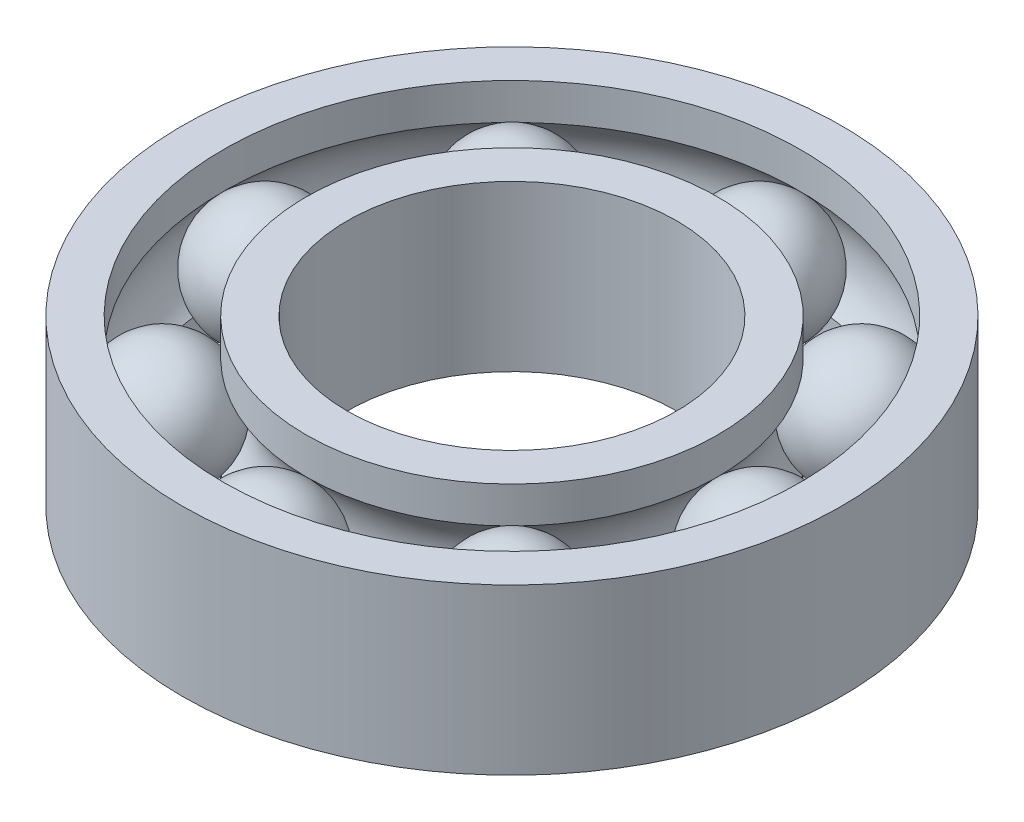
ISO-10303-21;
HEADER;
FILE_DESCRIPTION(('STEP AP214'),'2;1');
FILE_NAME('part.step','',(''),(''),'','','');
FILE_SCHEMA(('AUTOMOTIVE_DESIGN { 1 0 10303 214 1 1 1 1 }'));
ENDSEC;
DATA;
#1=APPLICATION_CONTEXT('core data for automotive mechanical design processes');
#2=APPLICATION_PROTOCOL_DEFINITION('international standard','automotive_design',2000,#1);
#3=PRODUCT_CONTEXT('',#1,'mechanical');
#4=PRODUCT('Part','Part','',(#3));
#5=PRODUCT_RELATED_PRODUCT_CATEGORY('part','',(#4));
#6=PRODUCT_DEFINITION_FORMATION('','',#4);
#7=PRODUCT_DEFINITION_CONTEXT('part definition',#1,'design');
#8=PRODUCT_DEFINITION('design','',#6,#7);
#9=PRODUCT_DEFINITION_SHAPE('','',#8);
#10=(LENGTH_UNIT() NAMED_UNIT(*) SI_UNIT(.MILLI.,.METRE.));
#11=(NAMED_UNIT(*) PLANE_ANGLE_UNIT() SI_UNIT($,.RADIAN.));
#12=(NAMED_UNIT(*) SI_UNIT($,.STERADIAN.) SOLID_ANGLE_UNIT());
#13=UNCERTAINTY_MEASURE_WITH_UNIT(LENGTH_MEASURE(1.E-05),#10,'distance_accuracy_value','');
#14=(GEOMETRIC_REPRESENTATION_CONTEXT(3) GLOBAL_UNCERTAINTY_ASSIGNED_CONTEXT((#13)) GLOBAL_UNIT_ASSIGNED_CONTEXT((#10,
#11,#12)) REPRESENTATION_CONTEXT('',''));
#15=CARTESIAN_POINT('',(0.,0.,0.));
#16=DIRECTION('',(0.,0.,1.));
#17=DIRECTION('',(1.,0.,0.));
#18=AXIS2_PLACEMENT_3D('',#15,#16,#17);
#19=CARTESIAN_POINT('',(-8.4808867879679,0.,8.48088678796769));
#20=DIRECTION('',(0.,1.,0.));
#21=DIRECTION('',(0.707106781186556,0.,-0.707106781186539));
#22=AXIS2_PLACEMENT_3D('',#19,#20,#21);
#23=SPHERICAL_SURFACE('',#22,3.);
#24=CARTESIAN_POINT('',(-8.4808867879679,3.,8.48088678796769));
#25=VERTEX_POINT('',#24);
#26=VERTEX_LOOP('',#25);
#27=FACE_BOUND('',#26,.T.);
#28=ADVANCED_FACE('F47',(#27),#23,.T.);
#29=CLOSED_SHELL('',(#28));
#30=MANIFOLD_SOLID_BREP('B2',#29);
#31=CARTESIAN_POINT('',(-1.25628230749009E-13,0.,11.9937851164948));
#32=DIRECTION('',(0.,1.,0.));
#33=DIRECTION('',(0.,0.,-1.));
#34=AXIS2_PLACEMENT_3D('',#31,#32,#33);
#35=SPHERICAL_SURFACE('',#34,3.);
#36=CARTESIAN_POINT('',(-1.25628230749009E-13,3.,11.9937851164948));
#37=VERTEX_POINT('',#36);
#38=VERTEX_LOOP('',#37);
#39=FACE_BOUND('',#38,.T.);
#40=ADVANCED_FACE('F72',(#39),#35,.T.);
#41=CLOSED_SHELL('',(#40));
#42=MANIFOLD_SOLID_BREP('B6',#41);
#43=CARTESIAN_POINT('',(8.48088678796772,0.,8.48088678796787));
#44=DIRECTION('',(0.,1.,0.));
#45=DIRECTION('',(-0.707106781186541,0.,-0.707106781186554));
#46=AXIS2_PLACEMENT_3D('',#43,#44,#45);
#47=SPHERICAL_SURFACE('',#46,3.);
#48=CARTESIAN_POINT('',(8.48088678796772,3.,8.48088678796787));
#49=VERTEX_POINT('',#48);
#50=VERTEX_LOOP('',#49);
#51=FACE_BOUND('',#50,.T.);
#52=ADVANCED_FACE('F94',(#51),#47,.T.);
#53=CLOSED_SHELL('',(#52));
#54=MANIFOLD_SOLID_BREP('B43',#53);
#55=CARTESIAN_POINT('',(11.9937851164948,0.,0.));
#56=DIRECTION('',(0.,1.,0.));
#57=DIRECTION('',(-1.,0.,0.));
#58=AXIS2_PLACEMENT_3D('',#55,#56,#57);
#59=SPHERICAL_SURFACE('',#58,3.);
#60=CARTESIAN_POINT('',(11.9937851164948,3.,0.));
#61=VERTEX_POINT('',#60);
#62=VERTEX_LOOP('',#61);
#63=FACE_BOUND('',#62,.T.);
#64=ADVANCED_FACE('F118',(#63),#59,.T.);
#65=CLOSED_SHELL('',(#64));
#66=MANIFOLD_SOLID_BREP('B68',#65);
#67=CARTESIAN_POINT('',(8.48088678796784,0.,-8.48088678796775));
#68=DIRECTION('',(0.,1.,0.));
#69=DIRECTION('',(-0.707106781186551,0.,0.707106781186544));
#70=AXIS2_PLACEMENT_3D('',#67,#68,#69);
#71=SPHERICAL_SURFACE('',#70,3.);
#72=CARTESIAN_POINT('',(8.48088678796784,3.,-8.48088678796775));
#73=VERTEX_POINT('',#72);
#74=VERTEX_LOOP('',#73);
#75=FACE_BOUND('',#74,.T.);
#76=ADVANCED_FACE('F140',(#75),#71,.T.);
#77=CLOSED_SHELL('',(#76));
#78=MANIFOLD_SOLID_BREP('B90',#77);
#79=CARTESIAN_POINT('',(0.,0.,-11.9937851164948));
#80=DIRECTION('',(0.,1.,0.));
#81=DIRECTION('',(0.,0.,1.));
#82=AXIS2_PLACEMENT_3D('',#79,#80,#81);
#83=SPHERICAL_SURFACE('',#82,3.);
#84=CARTESIAN_POINT('',(0.,3.,-11.9937851164948));
#85=VERTEX_POINT('',#84);
#86=VERTEX_LOOP('',#85);
#87=FACE_BOUND('',#86,.T.);
#88=ADVANCED_FACE('F162',(#87),#83,.T.);
#89=CLOSED_SHELL('',(#88));
#90=MANIFOLD_SOLID_BREP('B114',#89);
#91=CARTESIAN_POINT('',(-8.48088678796778,0.,-8.48088678796781));
#92=DIRECTION('',(0.,1.,0.));
#93=DIRECTION('',(0.707106781186546,0.,0.707106781186549));
#94=AXIS2_PLACEMENT_3D('',#91,#92,#93);
#95=SPHERICAL_SURFACE('',#94,3.);
#96=CARTESIAN_POINT('',(-8.48088678796778,3.,-8.48088678796781));
#97=VERTEX_POINT('',#96);
#98=VERTEX_LOOP('',#97);
#99=FACE_BOUND('',#98,.T.);
#100=ADVANCED_FACE('F186',(#99),#95,.T.);
#101=CLOSED_SHELL('',(#100));
#102=MANIFOLD_SOLID_BREP('B136',#101);
#103=CARTESIAN_POINT('',(0.,0.,0.));
#104=DIRECTION('',(0.,1.,0.));
#105=DIRECTION('',(0.,0.,1.));
#106=AXIS2_PLACEMENT_3D('',#103,#104,#105);
#107=TOROIDAL_SURFACE('',#106,12.,3.);
#108=CARTESIAN_POINT('',(0.,-2.23606797749979,0.));
#109=DIRECTION('',(0.,1.,0.));
#110=DIRECTION('',(0.,0.,1.));
#111=AXIS2_PLACEMENT_3D('',#108,#109,#110);
#112=CIRCLE('',#111,10.);
#113=CARTESIAN_POINT('',(0.,-2.23606797749979,10.));
#114=VERTEX_POINT('',#113);
#115=EDGE_CURVE('E185',#114,#114,#112,.T.);
#116=ORIENTED_EDGE('',*,*,#115,.T.);
#117=EDGE_LOOP('',(#116));
#118=FACE_BOUND('',#117,.T.);
#119=CARTESIAN_POINT('',(0.,2.23606797749979,0.));
#120=DIRECTION('',(0.,1.,0.));
#121=DIRECTION('',(0.,0.,1.));
#122=AXIS2_PLACEMENT_3D('',#119,#120,#121);
#123=CIRCLE('',#122,10.);
#124=CARTESIAN_POINT('',(0.,2.23606797749979,10.));
#125=VERTEX_POINT('',#124);
#126=EDGE_CURVE('E232',#125,#125,#123,.T.);
#127=ORIENTED_EDGE('',*,*,#126,.F.);
#128=EDGE_LOOP('',(#127));
#129=FACE_BOUND('',#128,.T.);
#130=ADVANCED_FACE('F210',(#118,#129),#107,.F.);
#131=CARTESIAN_POINT('',(0.,8.8,0.));
#132=DIRECTION('',(0.,1.,0.));
#133=DIRECTION('',(0.,0.,1.));
#134=AXIS2_PLACEMENT_3D('',#131,#132,#133);
#135=CYLINDRICAL_SURFACE('',#134,10.);
#136=CARTESIAN_POINT('',(0.,-4.,0.));
#137=DIRECTION('',(0.,1.,0.));
#138=DIRECTION('',(0.,0.,1.));
#139=AXIS2_PLACEMENT_3D('',#136,#137,#138);
#140=CIRCLE('',#139,10.);
#141=CARTESIAN_POINT('',(0.,-4.,10.));
#142=VERTEX_POINT('',#141);
#143=EDGE_CURVE('E216',#142,#142,#140,.T.);
#144=ORIENTED_EDGE('',*,*,#143,.T.);
#145=EDGE_LOOP('',(#144));
#146=FACE_BOUND('',#145,.T.);
#147=ORIENTED_EDGE('',*,*,#115,.F.);
#148=EDGE_LOOP('',(#147));
#149=FACE_BOUND('',#148,.T.);
#150=ADVANCED_FACE('F240',(#146,#149),#135,.T.);
#151=CARTESIAN_POINT('',(-8.,-4.,0.));
#152=DIRECTION('',(0.,-1.,0.));
#153=DIRECTION('',(0.,0.,-1.));
#154=AXIS2_PLACEMENT_3D('',#151,#152,#153);
#155=PLANE('',#154);
#156=CARTESIAN_POINT('',(0.,-4.,0.));
#157=DIRECTION('',(0.,1.,0.));
#158=DIRECTION('',(0.,0.,1.));
#159=AXIS2_PLACEMENT_3D('',#156,#157,#158);
#160=CIRCLE('',#159,8.);
#161=CARTESIAN_POINT('',(0.,-4.,8.));
#162=VERTEX_POINT('',#161);
#163=EDGE_CURVE('E220',#162,#162,#160,.T.);
#164=ORIENTED_EDGE('',*,*,#163,.T.);
#165=EDGE_LOOP('',(#164));
#166=FACE_BOUND('',#165,.T.);
#167=ORIENTED_EDGE('',*,*,#143,.F.);
#168=EDGE_LOOP('',(#167));
#169=FACE_BOUND('',#168,.T.);
#170=ADVANCED_FACE('F244',(#166,#169),#155,.T.);
#171=CARTESIAN_POINT('',(0.,8.8,0.));
#172=DIRECTION('',(0.,1.,0.));
#173=DIRECTION('',(0.,0.,1.));
#174=AXIS2_PLACEMENT_3D('',#171,#172,#173);
#175=CYLINDRICAL_SURFACE('',#174,8.);
#176=CARTESIAN_POINT('',(0.,4.00000000000001,0.));
#177=DIRECTION('',(0.,1.,0.));
#178=DIRECTION('',(0.,0.,1.));
#179=AXIS2_PLACEMENT_3D('',#176,#177,#178);
#180=CIRCLE('',#179,8.);
#181=CARTESIAN_POINT('',(0.,4.00000000000001,8.));
#182=VERTEX_POINT('',#181);
#183=EDGE_CURVE('E224',#182,#182,#180,.T.);
#184=ORIENTED_EDGE('',*,*,#183,.T.);
#185=EDGE_LOOP('',(#184));
#186=FACE_BOUND('',#185,.T.);
#187=ORIENTED_EDGE('',*,*,#163,.F.);
#188=EDGE_LOOP('',(#187));
#189=FACE_BOUND('',#188,.T.);
#190=ADVANCED_FACE('F248',(#186,#189),#175,.F.);
#191=CARTESIAN_POINT('',(-8.,4.00000000000001,0.));
#192=DIRECTION('',(0.,1.,0.));
#193=DIRECTION('',(0.,0.,1.));
#194=AXIS2_PLACEMENT_3D('',#191,#192,#193);
#195=PLANE('',#194);
#196=CARTESIAN_POINT('',(0.,4.00000000000001,0.));
#197=DIRECTION('',(0.,1.,0.));
#198=DIRECTION('',(0.,0.,1.));
#199=AXIS2_PLACEMENT_3D('',#196,#197,#198);
#200=CIRCLE('',#199,10.);
#201=CARTESIAN_POINT('',(0.,4.00000000000001,10.));
#202=VERTEX_POINT('',#201);
#203=EDGE_CURVE('E229',#202,#202,#200,.T.);
#204=ORIENTED_EDGE('',*,*,#203,.T.);
#205=EDGE_LOOP('',(#204));
#206=FACE_BOUND('',#205,.T.);
#207=ORIENTED_EDGE('',*,*,#183,.F.);
#208=EDGE_LOOP('',(#207));
#209=FACE_BOUND('',#208,.T.);
#210=ADVANCED_FACE('F255',(#206,#209),#195,.T.);
#211=CARTESIAN_POINT('',(0.,8.8,0.));
#212=DIRECTION('',(0.,1.,0.));
#213=DIRECTION('',(0.,0.,1.));
#214=AXIS2_PLACEMENT_3D('',#211,#212,#213);
#215=CYLINDRICAL_SURFACE('',#214,10.);
#216=ORIENTED_EDGE('',*,*,#126,.T.);
#217=EDGE_LOOP('',(#216));
#218=FACE_BOUND('',#217,.T.);
#219=ORIENTED_EDGE('',*,*,#203,.F.);
#220=EDGE_LOOP('',(#219));
#221=FACE_BOUND('',#220,.T.);
#222=ADVANCED_FACE('F236',(#218,#221),#215,.T.);
#223=CLOSED_SHELL('',(#130,#150,#170,#190,#210,#222));
#224=MANIFOLD_SOLID_BREP('B158',#223);
#225=CARTESIAN_POINT('',(0.,8.8,0.));
#226=DIRECTION('',(0.,1.,0.));
#227=DIRECTION('',(0.,0.,1.));
#228=AXIS2_PLACEMENT_3D('',#225,#226,#227);
#229=CYLINDRICAL_SURFACE('',#228,14.);
#230=CARTESIAN_POINT('',(0.,-2.23606797749979,0.));
#231=DIRECTION('',(0.,1.,0.));
#232=DIRECTION('',(0.,0.,1.));
#233=AXIS2_PLACEMENT_3D('',#230,#231,#232);
#234=CIRCLE('',#233,14.);
#235=CARTESIAN_POINT('',(0.,-2.23606797749979,14.));
#236=VERTEX_POINT('',#235);
#237=EDGE_CURVE('E209',#236,#236,#234,.T.);
#238=ORIENTED_EDGE('',*,*,#237,.T.);
#239=EDGE_LOOP('',(#238));
#240=FACE_BOUND('',#239,.T.);
#241=CARTESIAN_POINT('',(0.,-4.,0.));
#242=DIRECTION('',(0.,1.,0.));
#243=DIRECTION('',(0.,0.,1.));
#244=AXIS2_PLACEMENT_3D('',#241,#242,#243);
#245=CIRCLE('',#244,14.);
#246=CARTESIAN_POINT('',(0.,-4.,14.));
#247=VERTEX_POINT('',#246);
#248=EDGE_CURVE('E335',#247,#247,#245,.T.);
#249=ORIENTED_EDGE('',*,*,#248,.F.);
#250=EDGE_LOOP('',(#249));
#251=FACE_BOUND('',#250,.T.);
#252=ADVANCED_FACE('F313',(#240,#251),#229,.F.);
#253=CARTESIAN_POINT('',(0.,0.,0.));
#254=DIRECTION('',(0.,1.,0.));
#255=DIRECTION('',(0.,0.,1.));
#256=AXIS2_PLACEMENT_3D('',#253,#254,#255);
#257=TOROIDAL_SURFACE('',#256,12.,3.);
#258=CARTESIAN_POINT('',(0.,2.23606797749979,0.));
#259=DIRECTION('',(0.,1.,0.));
#260=DIRECTION('',(0.,0.,1.));
#261=AXIS2_PLACEMENT_3D('',#258,#259,#260);
#262=CIRCLE('',#261,14.);
#263=CARTESIAN_POINT('',(0.,2.23606797749979,14.));
#264=VERTEX_POINT('',#263);
#265=EDGE_CURVE('E319',#264,#264,#262,.T.);
#266=ORIENTED_EDGE('',*,*,#265,.T.);
#267=EDGE_LOOP('',(#266));
#268=FACE_BOUND('',#267,.T.);
#269=ORIENTED_EDGE('',*,*,#237,.F.);
#270=EDGE_LOOP('',(#269));
#271=FACE_BOUND('',#270,.T.);
#272=ADVANCED_FACE('F343',(#268,#271),#257,.F.);
#273=CARTESIAN_POINT('',(0.,8.8,0.));
#274=DIRECTION('',(0.,1.,0.));
#275=DIRECTION('',(0.,0.,1.));
#276=AXIS2_PLACEMENT_3D('',#273,#274,#275);
#277=CYLINDRICAL_SURFACE('',#276,14.);
#278=CARTESIAN_POINT('',(0.,4.,0.));
#279=DIRECTION('',(0.,1.,0.));
#280=DIRECTION('',(0.,0.,1.));
#281=AXIS2_PLACEMENT_3D('',#278,#279,#280);
#282=CIRCLE('',#281,14.);
#283=CARTESIAN_POINT('',(0.,4.,14.));
#284=VERTEX_POINT('',#283);
#285=EDGE_CURVE('E323',#284,#284,#282,.T.);
#286=ORIENTED_EDGE('',*,*,#285,.T.);
#287=EDGE_LOOP('',(#286));
#288=FACE_BOUND('',#287,.T.);
#289=ORIENTED_EDGE('',*,*,#265,.F.);
#290=EDGE_LOOP('',(#289));
#291=FACE_BOUND('',#290,.T.);
#292=ADVANCED_FACE('F347',(#288,#291),#277,.F.);
#293=CARTESIAN_POINT('',(-16.,4.,0.));
#294=DIRECTION('',(0.,1.,0.));
#295=DIRECTION('',(0.,0.,1.));
#296=AXIS2_PLACEMENT_3D('',#293,#294,#295);
#297=PLANE('',#296);
#298=CARTESIAN_POINT('',(0.,4.,0.));
#299=DIRECTION('',(0.,1.,0.));
#300=DIRECTION('',(0.,0.,1.));
#301=AXIS2_PLACEMENT_3D('',#298,#299,#300);
#302=CIRCLE('',#301,16.);
#303=CARTESIAN_POINT('',(0.,4.,16.));
#304=VERTEX_POINT('',#303);
#305=EDGE_CURVE('E327',#304,#304,#302,.T.);
#306=ORIENTED_EDGE('',*,*,#305,.T.);
#307=EDGE_LOOP('',(#306));
#308=FACE_BOUND('',#307,.T.);
#309=ORIENTED_EDGE('',*,*,#285,.F.);
#310=EDGE_LOOP('',(#309));
#311=FACE_BOUND('',#310,.T.);
#312=ADVANCED_FACE('F351',(#308,#311),#297,.T.);
#313=CARTESIAN_POINT('',(0.,8.8,0.));
#314=DIRECTION('',(0.,1.,0.));
#315=DIRECTION('',(0.,0.,1.));
#316=AXIS2_PLACEMENT_3D('',#313,#314,#315);
#317=CYLINDRICAL_SURFACE('',#316,16.);
#318=CARTESIAN_POINT('',(0.,-4.,0.));
#319=DIRECTION('',(0.,1.,0.));
#320=DIRECTION('',(0.,0.,1.));
#321=AXIS2_PLACEMENT_3D('',#318,#319,#320);
#322=CIRCLE('',#321,16.);
#323=CARTESIAN_POINT('',(0.,-4.,16.));
#324=VERTEX_POINT('',#323);
#325=EDGE_CURVE('E332',#324,#324,#322,.T.);
#326=ORIENTED_EDGE('',*,*,#325,.T.);
#327=EDGE_LOOP('',(#326));
#328=FACE_BOUND('',#327,.T.);
#329=ORIENTED_EDGE('',*,*,#305,.F.);
#330=EDGE_LOOP('',(#329));
#331=FACE_BOUND('',#330,.T.);
#332=ADVANCED_FACE('F358',(#328,#331),#317,.T.);
#333=CARTESIAN_POINT('',(-14.,-4.,0.));
#334=DIRECTION('',(0.,-1.,0.));
#335=DIRECTION('',(0.,0.,-1.));
#336=AXIS2_PLACEMENT_3D('',#333,#334,#335);
#337=PLANE('',#336);
#338=ORIENTED_EDGE('',*,*,#248,.T.);
#339=EDGE_LOOP('',(#338));
#340=FACE_BOUND('',#339,.T.);
#341=ORIENTED_EDGE('',*,*,#325,.F.);
#342=EDGE_LOOP('',(#341));
#343=FACE_BOUND('',#342,.T.);
#344=ADVANCED_FACE('F339',(#340,#343),#337,.T.);
#345=CLOSED_SHELL('',(#252,#272,#292,#312,#332,#344));
#346=MANIFOLD_SOLID_BREP('B180',#345);
#347=CARTESIAN_POINT('',(-11.9937851164948,0.,0.));
#348=DIRECTION('',(0.,1.,0.));
#349=DIRECTION('',(1.,0.,0.));
#350=AXIS2_PLACEMENT_3D('',#347,#348,#349);
#351=SPHERICAL_SURFACE('',#350,3.);
#352=CARTESIAN_POINT('',(-11.9937851164948,3.,0.));
#353=VERTEX_POINT('',#352);
#354=VERTEX_LOOP('',#353);
#355=FACE_BOUND('',#354,.T.);
#356=ADVANCED_FACE('F410',(#355),#351,.T.);
#357=CLOSED_SHELL('',(#356));
#358=MANIFOLD_SOLID_BREP('B204',#357);
#359=ADVANCED_BREP_SHAPE_REPRESENTATION('',(#18,#30,#42,#54,#66,#78,#90,#102,#224,#346,#358),#14);
#360=SHAPE_DEFINITION_REPRESENTATION(#9,#359);
ENDSEC;
END-ISO-10303-21;
